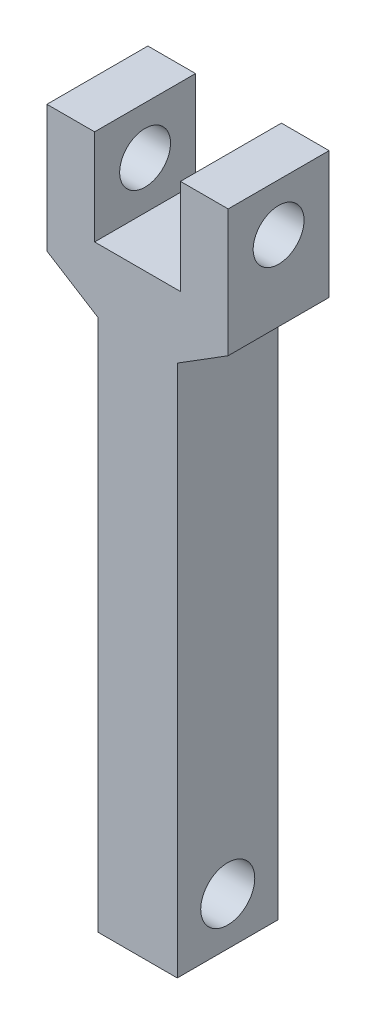
ISO-10303-21;
HEADER;
FILE_DESCRIPTION(('STEP AP214'),'2;1');
FILE_NAME('part.step','',(''),(''),'','','');
FILE_SCHEMA(('AUTOMOTIVE_DESIGN { 1 0 10303 214 1 1 1 1 }'));
ENDSEC;
DATA;
#1=APPLICATION_CONTEXT('core data for automotive mechanical design processes');
#2=APPLICATION_PROTOCOL_DEFINITION('international standard','automotive_design',2000,#1);
#3=PRODUCT_CONTEXT('',#1,'mechanical');
#4=PRODUCT('Part','Part','',(#3));
#5=PRODUCT_RELATED_PRODUCT_CATEGORY('part','',(#4));
#6=PRODUCT_DEFINITION_FORMATION('','',#4);
#7=PRODUCT_DEFINITION_CONTEXT('part definition',#1,'design');
#8=PRODUCT_DEFINITION('design','',#6,#7);
#9=PRODUCT_DEFINITION_SHAPE('','',#8);
#10=(LENGTH_UNIT() NAMED_UNIT(*) SI_UNIT(.MILLI.,.METRE.));
#11=(NAMED_UNIT(*) PLANE_ANGLE_UNIT() SI_UNIT($,.RADIAN.));
#12=(NAMED_UNIT(*) SI_UNIT($,.STERADIAN.) SOLID_ANGLE_UNIT());
#13=UNCERTAINTY_MEASURE_WITH_UNIT(LENGTH_MEASURE(1.E-05),#10,'distance_accuracy_value','');
#14=(GEOMETRIC_REPRESENTATION_CONTEXT(3) GLOBAL_UNCERTAINTY_ASSIGNED_CONTEXT((#13)) GLOBAL_UNIT_ASSIGNED_CONTEXT((#10,
#11,#12)) REPRESENTATION_CONTEXT('',''));
#15=CARTESIAN_POINT('',(0.,0.,0.));
#16=DIRECTION('',(0.,0.,1.));
#17=DIRECTION('',(1.,0.,0.));
#18=AXIS2_PLACEMENT_3D('',#15,#16,#17);
#19=CARTESIAN_POINT('',(2.5,-3.,3.175));
#20=DIRECTION('',(-1.,0.,0.));
#21=DIRECTION('',(0.,0.,1.));
#22=AXIS2_PLACEMENT_3D('',#19,#20,#21);
#23=PLANE('',#22);
#24=CARTESIAN_POINT('',(2.5,0.,0.));
#25=DIRECTION('',(-1.,0.,0.));
#26=DIRECTION('',(0.,0.,1.));
#27=AXIS2_PLACEMENT_3D('',#24,#25,#26);
#28=CIRCLE('',#27,1.7);
#29=CARTESIAN_POINT('',(2.5,0.,1.7));
#30=VERTEX_POINT('',#29);
#31=EDGE_CURVE('E312',#30,#30,#28,.T.);
#32=ORIENTED_EDGE('',*,*,#31,.T.);
#33=EDGE_LOOP('',(#32));
#34=FACE_BOUND('',#33,.T.);
#35=DIRECTION('',(0.,1.,0.));
#36=VECTOR('',#35,1.);
#37=CARTESIAN_POINT('',(2.5,-3.,-3.175));
#38=LINE('',#37,#36);
#39=CARTESIAN_POINT('',(2.5,-3.,-3.175));
#40=VERTEX_POINT('',#39);
#41=CARTESIAN_POINT('',(2.5,30.5,-3.175));
#42=VERTEX_POINT('',#41);
#43=EDGE_CURVE('E171',#40,#42,#38,.T.);
#44=ORIENTED_EDGE('',*,*,#43,.T.);
#45=DIRECTION('',(0.,0.,-1.));
#46=VECTOR('',#45,1.);
#47=CARTESIAN_POINT('',(2.5,30.5,3.175));
#48=LINE('',#47,#46);
#49=CARTESIAN_POINT('',(2.5,30.5,3.175));
#50=VERTEX_POINT('',#49);
#51=EDGE_CURVE('E11',#50,#42,#48,.T.);
#52=ORIENTED_EDGE('',*,*,#51,.F.);
#53=DIRECTION('',(0.,1.,0.));
#54=VECTOR('',#53,1.);
#55=CARTESIAN_POINT('',(2.5,-3.,3.175));
#56=LINE('',#55,#54);
#57=CARTESIAN_POINT('',(2.5,-3.,3.175));
#58=VERTEX_POINT('',#57);
#59=EDGE_CURVE('E206',#58,#50,#56,.T.);
#60=ORIENTED_EDGE('',*,*,#59,.F.);
#61=DIRECTION('',(0.,0.,-1.));
#62=VECTOR('',#61,1.);
#63=CARTESIAN_POINT('',(2.5,-3.,3.175));
#64=LINE('',#63,#62);
#65=EDGE_CURVE('E167',#58,#40,#64,.T.);
#66=ORIENTED_EDGE('',*,*,#65,.T.);
#67=EDGE_LOOP('',(#44,#52,#60,#66));
#68=FACE_BOUND('',#67,.T.);
#69=ADVANCED_FACE('F45',(#34,#68),#23,.F.);
#70=CARTESIAN_POINT('',(2.5,30.5,3.175));
#71=DIRECTION('',(-0.529998940003181,0.847998304005087,0.));
#72=DIRECTION('',(-0.847998304005087,-0.529998940003181,0.));
#73=AXIS2_PLACEMENT_3D('',#70,#71,#72);
#74=PLANE('',#73);
#75=DIRECTION('',(0.847998304005087,0.529998940003181,0.));
#76=VECTOR('',#75,1.);
#77=CARTESIAN_POINT('',(2.5,30.5,-3.175));
#78=LINE('',#77,#76);
#79=CARTESIAN_POINT('',(5.70000000000001,32.5,-3.175));
#80=VERTEX_POINT('',#79);
#81=EDGE_CURVE('E175',#42,#80,#78,.T.);
#82=ORIENTED_EDGE('',*,*,#81,.T.);
#83=DIRECTION('',(0.,0.,-1.));
#84=VECTOR('',#83,1.);
#85=CARTESIAN_POINT('',(5.70000000000001,32.5,3.175));
#86=LINE('',#85,#84);
#87=CARTESIAN_POINT('',(5.70000000000001,32.5,3.175));
#88=VERTEX_POINT('',#87);
#89=EDGE_CURVE('E55',#88,#80,#86,.T.);
#90=ORIENTED_EDGE('',*,*,#89,.F.);
#91=DIRECTION('',(0.847998304005087,0.529998940003181,0.));
#92=VECTOR('',#91,1.);
#93=CARTESIAN_POINT('',(2.5,30.5,3.175));
#94=LINE('',#93,#92);
#95=EDGE_CURVE('E118',#50,#88,#94,.T.);
#96=ORIENTED_EDGE('',*,*,#95,.F.);
#97=ORIENTED_EDGE('',*,*,#51,.T.);
#98=EDGE_LOOP('',(#82,#90,#96,#97));
#99=FACE_BOUND('',#98,.T.);
#100=ADVANCED_FACE('F303',(#99),#74,.F.);
#101=CARTESIAN_POINT('',(5.70000000000001,32.5,3.175));
#102=DIRECTION('',(-1.,0.,0.));
#103=DIRECTION('',(0.,-1.,0.));
#104=AXIS2_PLACEMENT_3D('',#101,#102,#103);
#105=PLANE('',#104);
#106=CARTESIAN_POINT('',(5.70000000000001,37.5,0.));
#107=DIRECTION('',(1.,0.,0.));
#108=DIRECTION('',(0.,0.,-1.));
#109=AXIS2_PLACEMENT_3D('',#106,#107,#108);
#110=CIRCLE('',#109,1.6);
#111=CARTESIAN_POINT('',(5.70000000000001,37.5,-1.6));
#112=VERTEX_POINT('',#111);
#113=EDGE_CURVE('E322',#112,#112,#110,.T.);
#114=ORIENTED_EDGE('',*,*,#113,.F.);
#115=EDGE_LOOP('',(#114));
#116=FACE_BOUND('',#115,.T.);
#117=DIRECTION('',(0.,1.,0.));
#118=VECTOR('',#117,1.);
#119=CARTESIAN_POINT('',(5.70000000000001,32.5,-3.175));
#120=LINE('',#119,#118);
#121=CARTESIAN_POINT('',(5.7,40.5,-3.175));
#122=VERTEX_POINT('',#121);
#123=EDGE_CURVE('E179',#80,#122,#120,.T.);
#124=ORIENTED_EDGE('',*,*,#123,.T.);
#125=DIRECTION('',(0.,0.,-1.));
#126=VECTOR('',#125,1.);
#127=CARTESIAN_POINT('',(5.7,40.5,3.175));
#128=LINE('',#127,#126);
#129=CARTESIAN_POINT('',(5.7,40.5,3.175));
#130=VERTEX_POINT('',#129);
#131=EDGE_CURVE('E233',#130,#122,#128,.T.);
#132=ORIENTED_EDGE('',*,*,#131,.F.);
#133=DIRECTION('',(0.,1.,0.));
#134=VECTOR('',#133,1.);
#135=CARTESIAN_POINT('',(5.70000000000001,32.5,3.175));
#136=LINE('',#135,#134);
#137=EDGE_CURVE('E244',#88,#130,#136,.T.);
#138=ORIENTED_EDGE('',*,*,#137,.F.);
#139=ORIENTED_EDGE('',*,*,#89,.T.);
#140=EDGE_LOOP('',(#124,#132,#138,#139));
#141=FACE_BOUND('',#140,.T.);
#142=ADVANCED_FACE('F242',(#116,#141),#105,.F.);
#143=CARTESIAN_POINT('',(5.7,40.5,3.175));
#144=DIRECTION('',(0.,-1.,0.));
#145=DIRECTION('',(1.,0.,0.));
#146=AXIS2_PLACEMENT_3D('',#143,#144,#145);
#147=PLANE('',#146);
#148=DIRECTION('',(-1.,0.,0.));
#149=VECTOR('',#148,1.);
#150=CARTESIAN_POINT('',(5.7,40.5,-3.175));
#151=LINE('',#150,#149);
#152=CARTESIAN_POINT('',(2.7,40.5,-3.175));
#153=VERTEX_POINT('',#152);
#154=EDGE_CURVE('E182',#122,#153,#151,.T.);
#155=ORIENTED_EDGE('',*,*,#154,.T.);
#156=DIRECTION('',(0.,0.,-1.));
#157=VECTOR('',#156,1.);
#158=CARTESIAN_POINT('',(2.7,40.5,3.175));
#159=LINE('',#158,#157);
#160=CARTESIAN_POINT('',(2.7,40.5,3.175));
#161=VERTEX_POINT('',#160);
#162=EDGE_CURVE('E229',#161,#153,#159,.T.);
#163=ORIENTED_EDGE('',*,*,#162,.F.);
#164=DIRECTION('',(-1.,0.,0.));
#165=VECTOR('',#164,1.);
#166=CARTESIAN_POINT('',(5.7,40.5,3.175));
#167=LINE('',#166,#165);
#168=EDGE_CURVE('E263',#130,#161,#167,.T.);
#169=ORIENTED_EDGE('',*,*,#168,.F.);
#170=ORIENTED_EDGE('',*,*,#131,.T.);
#171=EDGE_LOOP('',(#155,#163,#169,#170));
#172=FACE_BOUND('',#171,.T.);
#173=ADVANCED_FACE('F253',(#172),#147,.F.);
#174=CARTESIAN_POINT('',(2.7,40.5,3.175));
#175=DIRECTION('',(1.,0.,0.));
#176=DIRECTION('',(0.,0.,-1.));
#177=AXIS2_PLACEMENT_3D('',#174,#175,#176);
#178=PLANE('',#177);
#179=CARTESIAN_POINT('',(2.7,37.5,0.));
#180=DIRECTION('',(1.,0.,0.));
#181=DIRECTION('',(0.,0.,-1.));
#182=AXIS2_PLACEMENT_3D('',#179,#180,#181);
#183=CIRCLE('',#182,1.6);
#184=CARTESIAN_POINT('',(2.7,37.5,-1.6));
#185=VERTEX_POINT('',#184);
#186=EDGE_CURVE('E176',#185,#185,#183,.T.);
#187=ORIENTED_EDGE('',*,*,#186,.T.);
#188=EDGE_LOOP('',(#187));
#189=FACE_BOUND('',#188,.T.);
#190=DIRECTION('',(0.,-1.,0.));
#191=VECTOR('',#190,1.);
#192=CARTESIAN_POINT('',(2.7,40.5,-3.175));
#193=LINE('',#192,#191);
#194=CARTESIAN_POINT('',(2.7,34.5,-3.175));
#195=VERTEX_POINT('',#194);
#196=EDGE_CURVE('E185',#153,#195,#193,.T.);
#197=ORIENTED_EDGE('',*,*,#196,.T.);
#198=DIRECTION('',(0.,0.,-1.));
#199=VECTOR('',#198,1.);
#200=CARTESIAN_POINT('',(2.7,34.5,3.175));
#201=LINE('',#200,#199);
#202=CARTESIAN_POINT('',(2.7,34.5,3.175));
#203=VERTEX_POINT('',#202);
#204=EDGE_CURVE('E225',#203,#195,#201,.T.);
#205=ORIENTED_EDGE('',*,*,#204,.F.);
#206=DIRECTION('',(0.,-1.,0.));
#207=VECTOR('',#206,1.);
#208=CARTESIAN_POINT('',(2.7,40.5,3.175));
#209=LINE('',#208,#207);
#210=EDGE_CURVE('E259',#161,#203,#209,.T.);
#211=ORIENTED_EDGE('',*,*,#210,.F.);
#212=ORIENTED_EDGE('',*,*,#162,.T.);
#213=EDGE_LOOP('',(#197,#205,#211,#212));
#214=FACE_BOUND('',#213,.T.);
#215=ADVANCED_FACE('F257',(#189,#214),#178,.F.);
#216=CARTESIAN_POINT('',(2.7,34.5,3.175));
#217=DIRECTION('',(0.,-1.,0.));
#218=DIRECTION('',(0.,0.,-1.));
#219=AXIS2_PLACEMENT_3D('',#216,#217,#218);
#220=PLANE('',#219);
#221=DIRECTION('',(-1.,0.,0.));
#222=VECTOR('',#221,1.);
#223=CARTESIAN_POINT('',(2.7,34.5,-3.175));
#224=LINE('',#223,#222);
#225=CARTESIAN_POINT('',(-2.7,34.5,-3.175));
#226=VERTEX_POINT('',#225);
#227=EDGE_CURVE('E188',#195,#226,#224,.T.);
#228=ORIENTED_EDGE('',*,*,#227,.T.);
#229=DIRECTION('',(0.,0.,-1.));
#230=VECTOR('',#229,1.);
#231=CARTESIAN_POINT('',(-2.7,34.5,3.175));
#232=LINE('',#231,#230);
#233=CARTESIAN_POINT('',(-2.7,34.5,3.175));
#234=VERTEX_POINT('',#233);
#235=EDGE_CURVE('E221',#234,#226,#232,.T.);
#236=ORIENTED_EDGE('',*,*,#235,.F.);
#237=DIRECTION('',(-1.,0.,0.));
#238=VECTOR('',#237,1.);
#239=CARTESIAN_POINT('',(2.7,34.5,3.175));
#240=LINE('',#239,#238);
#241=EDGE_CURVE('E262',#203,#234,#240,.T.);
#242=ORIENTED_EDGE('',*,*,#241,.F.);
#243=ORIENTED_EDGE('',*,*,#204,.T.);
#244=EDGE_LOOP('',(#228,#236,#242,#243));
#245=FACE_BOUND('',#244,.T.);
#246=ADVANCED_FACE('F415',(#245),#220,.F.);
#247=CARTESIAN_POINT('',(-2.7,40.5,3.175));
#248=DIRECTION('',(-1.,0.,0.));
#249=DIRECTION('',(0.,0.,1.));
#250=AXIS2_PLACEMENT_3D('',#247,#248,#249);
#251=PLANE('',#250);
#252=CARTESIAN_POINT('',(-2.7,37.5,0.));
#253=DIRECTION('',(-1.,0.,0.));
#254=DIRECTION('',(0.,0.,1.));
#255=AXIS2_PLACEMENT_3D('',#252,#253,#254);
#256=CIRCLE('',#255,1.6);
#257=CARTESIAN_POINT('',(-2.7,37.5,1.6));
#258=VERTEX_POINT('',#257);
#259=EDGE_CURVE('E315',#258,#258,#256,.T.);
#260=ORIENTED_EDGE('',*,*,#259,.T.);
#261=EDGE_LOOP('',(#260));
#262=FACE_BOUND('',#261,.T.);
#263=DIRECTION('',(0.,1.,0.));
#264=VECTOR('',#263,1.);
#265=CARTESIAN_POINT('',(-2.7,40.5,-3.175));
#266=LINE('',#265,#264);
#267=CARTESIAN_POINT('',(-2.7,40.5,-3.175));
#268=VERTEX_POINT('',#267);
#269=EDGE_CURVE('E191',#226,#268,#266,.T.);
#270=ORIENTED_EDGE('',*,*,#269,.T.);
#271=DIRECTION('',(0.,0.,-1.));
#272=VECTOR('',#271,1.);
#273=CARTESIAN_POINT('',(-2.7,40.5,3.175));
#274=LINE('',#273,#272);
#275=CARTESIAN_POINT('',(-2.7,40.5,3.175));
#276=VERTEX_POINT('',#275);
#277=EDGE_CURVE('E217',#276,#268,#274,.T.);
#278=ORIENTED_EDGE('',*,*,#277,.F.);
#279=DIRECTION('',(0.,1.,0.));
#280=VECTOR('',#279,1.);
#281=CARTESIAN_POINT('',(-2.7,40.5,3.175));
#282=LINE('',#281,#280);
#283=EDGE_CURVE('E267',#234,#276,#282,.T.);
#284=ORIENTED_EDGE('',*,*,#283,.F.);
#285=ORIENTED_EDGE('',*,*,#235,.T.);
#286=EDGE_LOOP('',(#270,#278,#284,#285));
#287=FACE_BOUND('',#286,.T.);
#288=ADVANCED_FACE('F407',(#262,#287),#251,.F.);
#289=CARTESIAN_POINT('',(-5.7,40.5,3.175));
#290=DIRECTION('',(0.,-1.,0.));
#291=DIRECTION('',(1.,0.,0.));
#292=AXIS2_PLACEMENT_3D('',#289,#290,#291);
#293=PLANE('',#292);
#294=DIRECTION('',(-1.,0.,0.));
#295=VECTOR('',#294,1.);
#296=CARTESIAN_POINT('',(-5.7,40.5,-3.175));
#297=LINE('',#296,#295);
#298=CARTESIAN_POINT('',(-5.7,40.5,-3.175));
#299=VERTEX_POINT('',#298);
#300=EDGE_CURVE('E194',#268,#299,#297,.T.);
#301=ORIENTED_EDGE('',*,*,#300,.T.);
#302=DIRECTION('',(0.,0.,-1.));
#303=VECTOR('',#302,1.);
#304=CARTESIAN_POINT('',(-5.7,40.5,3.175));
#305=LINE('',#304,#303);
#306=CARTESIAN_POINT('',(-5.7,40.5,3.175));
#307=VERTEX_POINT('',#306);
#308=EDGE_CURVE('E213',#307,#299,#305,.T.);
#309=ORIENTED_EDGE('',*,*,#308,.F.);
#310=DIRECTION('',(-1.,0.,0.));
#311=VECTOR('',#310,1.);
#312=CARTESIAN_POINT('',(-5.7,40.5,3.175));
#313=LINE('',#312,#311);
#314=EDGE_CURVE('E274',#276,#307,#313,.T.);
#315=ORIENTED_EDGE('',*,*,#314,.F.);
#316=ORIENTED_EDGE('',*,*,#277,.T.);
#317=EDGE_LOOP('',(#301,#309,#315,#316));
#318=FACE_BOUND('',#317,.T.);
#319=ADVANCED_FACE('F282',(#318),#293,.F.);
#320=CARTESIAN_POINT('',(-5.70000000000001,32.5,3.175));
#321=DIRECTION('',(1.,0.,0.));
#322=DIRECTION('',(0.,1.,0.));
#323=AXIS2_PLACEMENT_3D('',#320,#321,#322);
#324=PLANE('',#323);
#325=CARTESIAN_POINT('',(-5.70000000000001,37.5,0.));
#326=DIRECTION('',(1.,0.,0.));
#327=DIRECTION('',(0.,0.,-1.));
#328=AXIS2_PLACEMENT_3D('',#325,#326,#327);
#329=CIRCLE('',#328,1.6);
#330=CARTESIAN_POINT('',(-5.70000000000001,37.5,-1.6));
#331=VERTEX_POINT('',#330);
#332=EDGE_CURVE('E468',#331,#331,#329,.T.);
#333=ORIENTED_EDGE('',*,*,#332,.T.);
#334=EDGE_LOOP('',(#333));
#335=FACE_BOUND('',#334,.T.);
#336=DIRECTION('',(0.,-1.,0.));
#337=VECTOR('',#336,1.);
#338=CARTESIAN_POINT('',(-5.70000000000001,32.5,-3.175));
#339=LINE('',#338,#337);
#340=CARTESIAN_POINT('',(-5.70000000000001,32.5,-3.175));
#341=VERTEX_POINT('',#340);
#342=EDGE_CURVE('E197',#299,#341,#339,.T.);
#343=ORIENTED_EDGE('',*,*,#342,.T.);
#344=DIRECTION('',(0.,0.,-1.));
#345=VECTOR('',#344,1.);
#346=CARTESIAN_POINT('',(-5.70000000000001,32.5,3.175));
#347=LINE('',#346,#345);
#348=CARTESIAN_POINT('',(-5.70000000000001,32.5,3.175));
#349=VERTEX_POINT('',#348);
#350=EDGE_CURVE('E160',#349,#341,#347,.T.);
#351=ORIENTED_EDGE('',*,*,#350,.F.);
#352=DIRECTION('',(0.,-1.,0.));
#353=VECTOR('',#352,1.);
#354=CARTESIAN_POINT('',(-5.70000000000001,32.5,3.175));
#355=LINE('',#354,#353);
#356=EDGE_CURVE('E149',#307,#349,#355,.T.);
#357=ORIENTED_EDGE('',*,*,#356,.F.);
#358=ORIENTED_EDGE('',*,*,#308,.T.);
#359=EDGE_LOOP('',(#343,#351,#357,#358));
#360=FACE_BOUND('',#359,.T.);
#361=ADVANCED_FACE('F286',(#335,#360),#324,.F.);
#362=CARTESIAN_POINT('',(-2.5,30.5,3.175));
#363=DIRECTION('',(0.529998940003181,0.847998304005087,0.));
#364=DIRECTION('',(-0.847998304005087,0.529998940003181,0.));
#365=AXIS2_PLACEMENT_3D('',#362,#363,#364);
#366=PLANE('',#365);
#367=DIRECTION('',(0.847998304005087,-0.529998940003181,0.));
#368=VECTOR('',#367,1.);
#369=CARTESIAN_POINT('',(-2.5,30.5,-3.175));
#370=LINE('',#369,#368);
#371=CARTESIAN_POINT('',(-2.5,30.5,-3.175));
#372=VERTEX_POINT('',#371);
#373=EDGE_CURVE('E158',#341,#372,#370,.T.);
#374=ORIENTED_EDGE('',*,*,#373,.T.);
#375=DIRECTION('',(0.,0.,-1.));
#376=VECTOR('',#375,1.);
#377=CARTESIAN_POINT('',(-2.5,30.5,3.175));
#378=LINE('',#377,#376);
#379=CARTESIAN_POINT('',(-2.5,30.5,3.175));
#380=VERTEX_POINT('',#379);
#381=EDGE_CURVE('E155',#380,#372,#378,.T.);
#382=ORIENTED_EDGE('',*,*,#381,.F.);
#383=DIRECTION('',(0.847998304005087,-0.529998940003181,0.));
#384=VECTOR('',#383,1.);
#385=CARTESIAN_POINT('',(-2.5,30.5,3.175));
#386=LINE('',#385,#384);
#387=EDGE_CURVE('E143',#349,#380,#386,.T.);
#388=ORIENTED_EDGE('',*,*,#387,.F.);
#389=ORIENTED_EDGE('',*,*,#350,.T.);
#390=EDGE_LOOP('',(#374,#382,#388,#389));
#391=FACE_BOUND('',#390,.T.);
#392=ADVANCED_FACE('F156',(#391),#366,.F.);
#393=CARTESIAN_POINT('',(-2.5,-3.,3.175));
#394=DIRECTION('',(1.,0.,0.));
#395=DIRECTION('',(0.,0.,-1.));
#396=AXIS2_PLACEMENT_3D('',#393,#394,#395);
#397=PLANE('',#396);
#398=CARTESIAN_POINT('',(-2.5,0.,0.));
#399=DIRECTION('',(1.,0.,0.));
#400=DIRECTION('',(0.,0.,-1.));
#401=AXIS2_PLACEMENT_3D('',#398,#399,#400);
#402=CIRCLE('',#401,1.7);
#403=CARTESIAN_POINT('',(-2.5,0.,-1.7));
#404=VERTEX_POINT('',#403);
#405=EDGE_CURVE('E48',#404,#404,#402,.T.);
#406=ORIENTED_EDGE('',*,*,#405,.T.);
#407=EDGE_LOOP('',(#406));
#408=FACE_BOUND('',#407,.T.);
#409=DIRECTION('',(0.,-1.,0.));
#410=VECTOR('',#409,1.);
#411=CARTESIAN_POINT('',(-2.5,-3.,-3.175));
#412=LINE('',#411,#410);
#413=CARTESIAN_POINT('',(-2.5,-3.,-3.175));
#414=VERTEX_POINT('',#413);
#415=EDGE_CURVE('E104',#372,#414,#412,.T.);
#416=ORIENTED_EDGE('',*,*,#415,.T.);
#417=DIRECTION('',(0.,0.,-1.));
#418=VECTOR('',#417,1.);
#419=CARTESIAN_POINT('',(-2.5,-3.,3.175));
#420=LINE('',#419,#418);
#421=CARTESIAN_POINT('',(-2.5,-3.,3.175));
#422=VERTEX_POINT('',#421);
#423=EDGE_CURVE('E161',#422,#414,#420,.T.);
#424=ORIENTED_EDGE('',*,*,#423,.F.);
#425=DIRECTION('',(0.,-1.,0.));
#426=VECTOR('',#425,1.);
#427=CARTESIAN_POINT('',(-2.5,-3.,3.175));
#428=LINE('',#427,#426);
#429=EDGE_CURVE('E147',#380,#422,#428,.T.);
#430=ORIENTED_EDGE('',*,*,#429,.F.);
#431=ORIENTED_EDGE('',*,*,#381,.T.);
#432=EDGE_LOOP('',(#416,#424,#430,#431));
#433=FACE_BOUND('',#432,.T.);
#434=ADVANCED_FACE('F163',(#408,#433),#397,.F.);
#435=CARTESIAN_POINT('',(-2.5,-3.,3.175));
#436=DIRECTION('',(0.,1.,0.));
#437=DIRECTION('',(0.,0.,1.));
#438=AXIS2_PLACEMENT_3D('',#435,#436,#437);
#439=PLANE('',#438);
#440=DIRECTION('',(1.,0.,0.));
#441=VECTOR('',#440,1.);
#442=CARTESIAN_POINT('',(-2.5,-3.,-3.175));
#443=LINE('',#442,#441);
#444=EDGE_CURVE('E110',#414,#40,#443,.T.);
#445=ORIENTED_EDGE('',*,*,#444,.T.);
#446=ORIENTED_EDGE('',*,*,#65,.F.);
#447=DIRECTION('',(1.,0.,0.));
#448=VECTOR('',#447,1.);
#449=CARTESIAN_POINT('',(-2.5,-3.,3.175));
#450=LINE('',#449,#448);
#451=EDGE_CURVE('E63',#422,#58,#450,.T.);
#452=ORIENTED_EDGE('',*,*,#451,.F.);
#453=ORIENTED_EDGE('',*,*,#423,.T.);
#454=EDGE_LOOP('',(#445,#446,#452,#453));
#455=FACE_BOUND('',#454,.T.);
#456=ADVANCED_FACE('F290',(#455),#439,.F.);
#457=CARTESIAN_POINT('',(0.,0.,3.175));
#458=DIRECTION('',(0.,0.,1.));
#459=DIRECTION('',(1.,0.,0.));
#460=AXIS2_PLACEMENT_3D('',#457,#458,#459);
#461=PLANE('',#460);
#462=ORIENTED_EDGE('',*,*,#59,.T.);
#463=ORIENTED_EDGE('',*,*,#95,.T.);
#464=ORIENTED_EDGE('',*,*,#137,.T.);
#465=ORIENTED_EDGE('',*,*,#168,.T.);
#466=ORIENTED_EDGE('',*,*,#210,.T.);
#467=ORIENTED_EDGE('',*,*,#241,.T.);
#468=ORIENTED_EDGE('',*,*,#283,.T.);
#469=ORIENTED_EDGE('',*,*,#314,.T.);
#470=ORIENTED_EDGE('',*,*,#356,.T.);
#471=ORIENTED_EDGE('',*,*,#387,.T.);
#472=ORIENTED_EDGE('',*,*,#429,.T.);
#473=ORIENTED_EDGE('',*,*,#451,.T.);
#474=EDGE_LOOP('',(#462,#463,#464,#465,#466,#467,#468,#469,#470,#471,#472,#473));
#475=FACE_BOUND('',#474,.T.);
#476=ADVANCED_FACE('F145',(#475),#461,.T.);
#477=CARTESIAN_POINT('',(0.,0.,-3.175));
#478=DIRECTION('',(0.,0.,1.));
#479=DIRECTION('',(1.,0.,0.));
#480=AXIS2_PLACEMENT_3D('',#477,#478,#479);
#481=PLANE('',#480);
#482=ORIENTED_EDGE('',*,*,#43,.F.);
#483=ORIENTED_EDGE('',*,*,#444,.F.);
#484=ORIENTED_EDGE('',*,*,#415,.F.);
#485=ORIENTED_EDGE('',*,*,#373,.F.);
#486=ORIENTED_EDGE('',*,*,#342,.F.);
#487=ORIENTED_EDGE('',*,*,#300,.F.);
#488=ORIENTED_EDGE('',*,*,#269,.F.);
#489=ORIENTED_EDGE('',*,*,#227,.F.);
#490=ORIENTED_EDGE('',*,*,#196,.F.);
#491=ORIENTED_EDGE('',*,*,#154,.F.);
#492=ORIENTED_EDGE('',*,*,#123,.F.);
#493=ORIENTED_EDGE('',*,*,#81,.F.);
#494=EDGE_LOOP('',(#482,#483,#484,#485,#486,#487,#488,#489,#490,#491,#492,#493));
#495=FACE_BOUND('',#494,.T.);
#496=ADVANCED_FACE('F248',(#495),#481,.F.);
#497=CARTESIAN_POINT('',(-5.70000000000001,0.,0.));
#498=DIRECTION('',(1.,0.,0.));
#499=DIRECTION('',(0.,0.,-1.));
#500=AXIS2_PLACEMENT_3D('',#497,#498,#499);
#501=CYLINDRICAL_SURFACE('',#500,1.7);
#502=ORIENTED_EDGE('',*,*,#405,.F.);
#503=EDGE_LOOP('',(#502));
#504=FACE_BOUND('',#503,.T.);
#505=ORIENTED_EDGE('',*,*,#31,.F.);
#506=EDGE_LOOP('',(#505));
#507=FACE_BOUND('',#506,.T.);
#508=ADVANCED_FACE('F344',(#504,#507),#501,.F.);
#509=CARTESIAN_POINT('',(-5.70000000000001,37.5,0.));
#510=DIRECTION('',(1.,0.,0.));
#511=DIRECTION('',(0.,0.,-1.));
#512=AXIS2_PLACEMENT_3D('',#509,#510,#511);
#513=CYLINDRICAL_SURFACE('',#512,1.6);
#514=ORIENTED_EDGE('',*,*,#332,.F.);
#515=EDGE_LOOP('',(#514));
#516=FACE_BOUND('',#515,.T.);
#517=ORIENTED_EDGE('',*,*,#259,.F.);
#518=EDGE_LOOP('',(#517));
#519=FACE_BOUND('',#518,.T.);
#520=ADVANCED_FACE('F338',(#516,#519),#513,.F.);
#521=ORIENTED_EDGE('',*,*,#113,.T.);
#522=EDGE_LOOP('',(#521));
#523=FACE_BOUND('',#522,.T.);
#524=ORIENTED_EDGE('',*,*,#186,.F.);
#525=EDGE_LOOP('',(#524));
#526=FACE_BOUND('',#525,.T.);
#527=ADVANCED_FACE('F336',(#523,#526),#513,.F.);
#528=CLOSED_SHELL('',(#69,#100,#142,#173,#215,#246,#288,#319,#361,#392,#434,#456,#476,#496,#508,
#520,#527));
#529=MANIFOLD_SOLID_BREP('B2',#528);
#530=ADVANCED_BREP_SHAPE_REPRESENTATION('',(#18,#529),#14);
#531=SHAPE_DEFINITION_REPRESENTATION(#9,#530);
ENDSEC;
END-ISO-10303-21;
